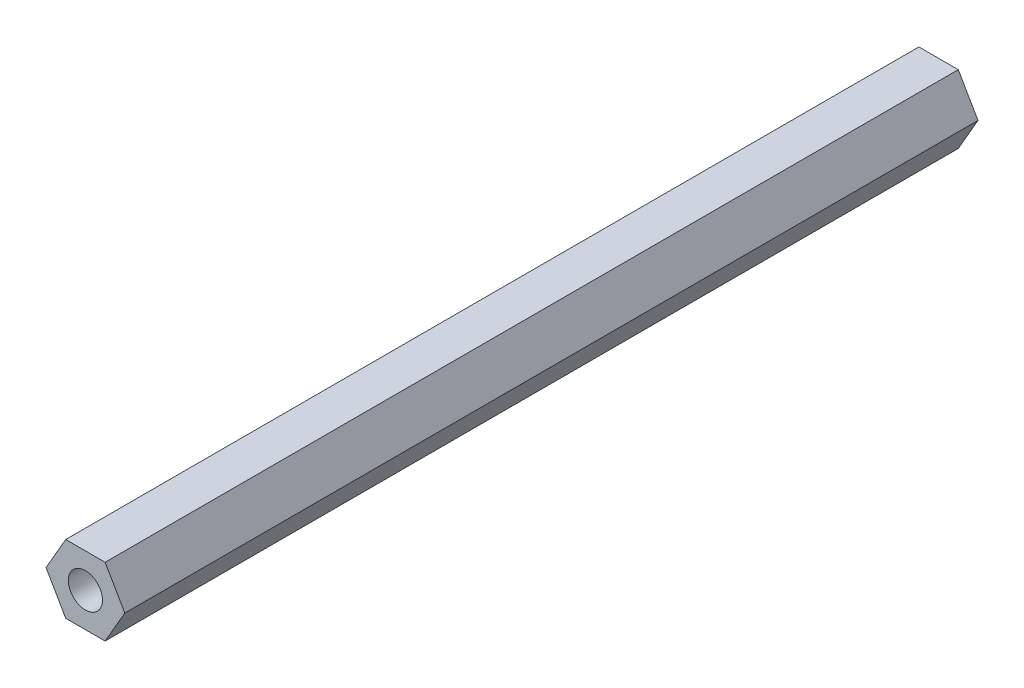
ISO-10303-21;
HEADER;
FILE_DESCRIPTION(('STEP AP214'),'2;1');
FILE_NAME('part.step','',(''),(''),'','','');
FILE_SCHEMA(('AUTOMOTIVE_DESIGN { 1 0 10303 214 1 1 1 1 }'));
ENDSEC;
DATA;
#1=APPLICATION_CONTEXT('core data for automotive mechanical design processes');
#2=APPLICATION_PROTOCOL_DEFINITION('international standard','automotive_design',2000,#1);
#3=PRODUCT_CONTEXT('',#1,'mechanical');
#4=PRODUCT('Part','Part','',(#3));
#5=PRODUCT_RELATED_PRODUCT_CATEGORY('part','',(#4));
#6=PRODUCT_DEFINITION_FORMATION('','',#4);
#7=PRODUCT_DEFINITION_CONTEXT('part definition',#1,'design');
#8=PRODUCT_DEFINITION('design','',#6,#7);
#9=PRODUCT_DEFINITION_SHAPE('','',#8);
#10=(LENGTH_UNIT() NAMED_UNIT(*) SI_UNIT(.MILLI.,.METRE.));
#11=(NAMED_UNIT(*) PLANE_ANGLE_UNIT() SI_UNIT($,.RADIAN.));
#12=(NAMED_UNIT(*) SI_UNIT($,.STERADIAN.) SOLID_ANGLE_UNIT());
#13=UNCERTAINTY_MEASURE_WITH_UNIT(LENGTH_MEASURE(1.E-05),#10,'distance_accuracy_value','');
#14=(GEOMETRIC_REPRESENTATION_CONTEXT(3) GLOBAL_UNCERTAINTY_ASSIGNED_CONTEXT((#13)) GLOBAL_UNIT_ASSIGNED_CONTEXT((#10,
#11,#12)) REPRESENTATION_CONTEXT('',''));
#15=CARTESIAN_POINT('',(0.,0.,0.));
#16=DIRECTION('',(0.,0.,1.));
#17=DIRECTION('',(1.,0.,0.));
#18=AXIS2_PLACEMENT_3D('',#15,#16,#17);
#19=CARTESIAN_POINT('',(3.66617420935419,-6.34999999999995,158.75));
#20=DIRECTION('',(-0.866025403784441,0.499999999999995,0.));
#21=DIRECTION('',(-0.499999999999995,-0.866025403784442,0.));
#22=AXIS2_PLACEMENT_3D('',#19,#20,#21);
#23=PLANE('',#22);
#24=DIRECTION('',(0.499999999999995,0.866025403784441,0.));
#25=VECTOR('',#24,1.);
#26=CARTESIAN_POINT('',(3.66617420935419,-6.34999999999995,0.));
#27=LINE('',#26,#25);
#28=CARTESIAN_POINT('',(3.66617420935419,-6.34999999999995,0.));
#29=VERTEX_POINT('',#28);
#30=CARTESIAN_POINT('',(7.33234841870824,0.,0.));
#31=VERTEX_POINT('',#30);
#32=EDGE_CURVE('E127',#29,#31,#27,.T.);
#33=ORIENTED_EDGE('',*,*,#32,.T.);
#34=DIRECTION('',(0.,0.,-1.));
#35=VECTOR('',#34,1.);
#36=CARTESIAN_POINT('',(7.33234841870824,0.,158.75));
#37=LINE('',#36,#35);
#38=CARTESIAN_POINT('',(7.33234841870824,0.,158.75));
#39=VERTEX_POINT('',#38);
#40=EDGE_CURVE('E11',#39,#31,#37,.T.);
#41=ORIENTED_EDGE('',*,*,#40,.F.);
#42=DIRECTION('',(0.499999999999995,0.866025403784441,0.));
#43=VECTOR('',#42,1.);
#44=CARTESIAN_POINT('',(3.66617420935419,-6.34999999999995,158.75));
#45=LINE('',#44,#43);
#46=CARTESIAN_POINT('',(3.66617420935419,-6.34999999999995,158.75));
#47=VERTEX_POINT('',#46);
#48=EDGE_CURVE('E138',#47,#39,#45,.T.);
#49=ORIENTED_EDGE('',*,*,#48,.F.);
#50=DIRECTION('',(0.,0.,-1.));
#51=VECTOR('',#50,1.);
#52=CARTESIAN_POINT('',(3.66617420935419,-6.34999999999995,158.75));
#53=LINE('',#52,#51);
#54=EDGE_CURVE('E123',#47,#29,#53,.T.);
#55=ORIENTED_EDGE('',*,*,#54,.T.);
#56=EDGE_LOOP('',(#33,#41,#49,#55));
#57=FACE_BOUND('',#56,.T.);
#58=ADVANCED_FACE('F43',(#57),#23,.F.);
#59=CARTESIAN_POINT('',(7.33234841870824,0.,158.75));
#60=DIRECTION('',(-0.866025403784438,-0.500000000000001,0.));
#61=DIRECTION('',(0.500000000000001,-0.866025403784438,0.));
#62=AXIS2_PLACEMENT_3D('',#59,#60,#61);
#63=PLANE('',#62);
#64=DIRECTION('',(-0.500000000000001,0.866025403784438,0.));
#65=VECTOR('',#64,1.);
#66=CARTESIAN_POINT('',(7.33234841870824,0.,0.));
#67=LINE('',#66,#65);
#68=CARTESIAN_POINT('',(3.6661742093541,6.35,0.));
#69=VERTEX_POINT('',#68);
#70=EDGE_CURVE('E130',#31,#69,#67,.T.);
#71=ORIENTED_EDGE('',*,*,#70,.T.);
#72=DIRECTION('',(0.,0.,-1.));
#73=VECTOR('',#72,1.);
#74=CARTESIAN_POINT('',(3.6661742093541,6.35,158.75));
#75=LINE('',#74,#73);
#76=CARTESIAN_POINT('',(3.6661742093541,6.35,158.75));
#77=VERTEX_POINT('',#76);
#78=EDGE_CURVE('E51',#77,#69,#75,.T.);
#79=ORIENTED_EDGE('',*,*,#78,.F.);
#80=DIRECTION('',(-0.500000000000001,0.866025403784438,0.));
#81=VECTOR('',#80,1.);
#82=CARTESIAN_POINT('',(7.33234841870824,0.,158.75));
#83=LINE('',#82,#81);
#84=EDGE_CURVE('E96',#39,#77,#83,.T.);
#85=ORIENTED_EDGE('',*,*,#84,.F.);
#86=ORIENTED_EDGE('',*,*,#40,.T.);
#87=EDGE_LOOP('',(#71,#79,#85,#86));
#88=FACE_BOUND('',#87,.T.);
#89=ADVANCED_FACE('F163',(#88),#63,.F.);
#90=CARTESIAN_POINT('',(3.6661742093541,6.35,158.75));
#91=DIRECTION('',(0.,-1.,0.));
#92=DIRECTION('',(1.,0.,0.));
#93=AXIS2_PLACEMENT_3D('',#90,#91,#92);
#94=PLANE('',#93);
#95=DIRECTION('',(-1.,0.,0.));
#96=VECTOR('',#95,1.);
#97=CARTESIAN_POINT('',(3.6661742093541,6.35,0.));
#98=LINE('',#97,#96);
#99=CARTESIAN_POINT('',(-3.66617420935415,6.34999999999997,0.));
#100=VERTEX_POINT('',#99);
#101=EDGE_CURVE('E133',#69,#100,#98,.T.);
#102=ORIENTED_EDGE('',*,*,#101,.T.);
#103=DIRECTION('',(0.,0.,-1.));
#104=VECTOR('',#103,1.);
#105=CARTESIAN_POINT('',(-3.66617420935415,6.34999999999997,158.75));
#106=LINE('',#105,#104);
#107=CARTESIAN_POINT('',(-3.66617420935415,6.34999999999997,158.75));
#108=VERTEX_POINT('',#107);
#109=EDGE_CURVE('E118',#108,#100,#106,.T.);
#110=ORIENTED_EDGE('',*,*,#109,.F.);
#111=DIRECTION('',(-1.,0.,0.));
#112=VECTOR('',#111,1.);
#113=CARTESIAN_POINT('',(3.6661742093541,6.35,158.75));
#114=LINE('',#113,#112);
#115=EDGE_CURVE('E109',#77,#108,#114,.T.);
#116=ORIENTED_EDGE('',*,*,#115,.F.);
#117=ORIENTED_EDGE('',*,*,#78,.T.);
#118=EDGE_LOOP('',(#102,#110,#116,#117));
#119=FACE_BOUND('',#118,.T.);
#120=ADVANCED_FACE('F144',(#119),#94,.F.);
#121=CARTESIAN_POINT('',(-3.66617420935415,6.34999999999997,158.75));
#122=DIRECTION('',(0.866025403784441,-0.499999999999995,0.));
#123=DIRECTION('',(0.499999999999995,0.866025403784442,0.));
#124=AXIS2_PLACEMENT_3D('',#121,#122,#123);
#125=PLANE('',#124);
#126=DIRECTION('',(-0.499999999999995,-0.866025403784442,0.));
#127=VECTOR('',#126,1.);
#128=CARTESIAN_POINT('',(-3.66617420935415,6.34999999999997,0.));
#129=LINE('',#128,#127);
#130=CARTESIAN_POINT('',(-7.33234841870824,0.,0.));
#131=VERTEX_POINT('',#130);
#132=EDGE_CURVE('E117',#100,#131,#129,.T.);
#133=ORIENTED_EDGE('',*,*,#132,.T.);
#134=DIRECTION('',(0.,0.,-1.));
#135=VECTOR('',#134,1.);
#136=CARTESIAN_POINT('',(-7.33234841870824,0.,158.75));
#137=LINE('',#136,#135);
#138=CARTESIAN_POINT('',(-7.33234841870824,0.,158.75));
#139=VERTEX_POINT('',#138);
#140=EDGE_CURVE('E114',#139,#131,#137,.T.);
#141=ORIENTED_EDGE('',*,*,#140,.F.);
#142=DIRECTION('',(-0.499999999999995,-0.866025403784442,0.));
#143=VECTOR('',#142,1.);
#144=CARTESIAN_POINT('',(-3.66617420935415,6.34999999999997,158.75));
#145=LINE('',#144,#143);
#146=EDGE_CURVE('E103',#108,#139,#145,.T.);
#147=ORIENTED_EDGE('',*,*,#146,.F.);
#148=ORIENTED_EDGE('',*,*,#109,.T.);
#149=EDGE_LOOP('',(#133,#141,#147,#148));
#150=FACE_BOUND('',#149,.T.);
#151=ADVANCED_FACE('F115',(#150),#125,.F.);
#152=CARTESIAN_POINT('',(-7.33234841870824,0.,158.75));
#153=DIRECTION('',(0.866025403784434,0.500000000000007,0.));
#154=DIRECTION('',(-0.500000000000007,0.866025403784435,0.));
#155=AXIS2_PLACEMENT_3D('',#152,#153,#154);
#156=PLANE('',#155);
#157=DIRECTION('',(0.500000000000007,-0.866025403784435,0.));
#158=VECTOR('',#157,1.);
#159=CARTESIAN_POINT('',(-7.33234841870824,0.,0.));
#160=LINE('',#159,#158);
#161=CARTESIAN_POINT('',(-3.66617420935406,-6.35000000000002,0.));
#162=VERTEX_POINT('',#161);
#163=EDGE_CURVE('E82',#131,#162,#160,.T.);
#164=ORIENTED_EDGE('',*,*,#163,.T.);
#165=DIRECTION('',(0.,0.,-1.));
#166=VECTOR('',#165,1.);
#167=CARTESIAN_POINT('',(-3.66617420935406,-6.35000000000002,158.75));
#168=LINE('',#167,#166);
#169=CARTESIAN_POINT('',(-3.66617420935406,-6.35000000000002,158.75));
#170=VERTEX_POINT('',#169);
#171=EDGE_CURVE('E119',#170,#162,#168,.T.);
#172=ORIENTED_EDGE('',*,*,#171,.F.);
#173=DIRECTION('',(0.500000000000007,-0.866025403784435,0.));
#174=VECTOR('',#173,1.);
#175=CARTESIAN_POINT('',(-7.33234841870824,0.,158.75));
#176=LINE('',#175,#174);
#177=EDGE_CURVE('E107',#139,#170,#176,.T.);
#178=ORIENTED_EDGE('',*,*,#177,.F.);
#179=ORIENTED_EDGE('',*,*,#140,.T.);
#180=EDGE_LOOP('',(#164,#172,#178,#179));
#181=FACE_BOUND('',#180,.T.);
#182=ADVANCED_FACE('F121',(#181),#156,.F.);
#183=CARTESIAN_POINT('',(-3.66617420935406,-6.35000000000002,158.75));
#184=DIRECTION('',(0.,1.,0.));
#185=DIRECTION('',(-1.,0.,0.));
#186=AXIS2_PLACEMENT_3D('',#183,#184,#185);
#187=PLANE('',#186);
#188=DIRECTION('',(1.,0.,0.));
#189=VECTOR('',#188,1.);
#190=CARTESIAN_POINT('',(-3.66617420935406,-6.35000000000002,0.));
#191=LINE('',#190,#189);
#192=EDGE_CURVE('E88',#162,#29,#191,.T.);
#193=ORIENTED_EDGE('',*,*,#192,.T.);
#194=ORIENTED_EDGE('',*,*,#54,.F.);
#195=DIRECTION('',(1.,0.,0.));
#196=VECTOR('',#195,1.);
#197=CARTESIAN_POINT('',(-3.66617420935406,-6.35000000000002,158.75));
#198=LINE('',#197,#196);
#199=EDGE_CURVE('E59',#170,#47,#198,.T.);
#200=ORIENTED_EDGE('',*,*,#199,.F.);
#201=ORIENTED_EDGE('',*,*,#171,.T.);
#202=EDGE_LOOP('',(#193,#194,#200,#201));
#203=FACE_BOUND('',#202,.T.);
#204=ADVANCED_FACE('F151',(#203),#187,.F.);
#205=CARTESIAN_POINT('',(0.,0.,158.75));
#206=DIRECTION('',(0.,0.,1.));
#207=DIRECTION('',(1.,0.,0.));
#208=AXIS2_PLACEMENT_3D('',#205,#206,#207);
#209=PLANE('',#208);
#210=CARTESIAN_POINT('',(0.,0.,158.75));
#211=DIRECTION('',(0.,0.,1.));
#212=DIRECTION('',(1.,0.,0.));
#213=AXIS2_PLACEMENT_3D('',#210,#211,#212);
#214=CIRCLE('',#213,3.175);
#215=CARTESIAN_POINT('',(3.175,0.,158.75));
#216=VERTEX_POINT('',#215);
#217=EDGE_CURVE('E219',#216,#216,#214,.T.);
#218=ORIENTED_EDGE('',*,*,#217,.F.);
#219=EDGE_LOOP('',(#218));
#220=FACE_BOUND('',#219,.T.);
#221=ORIENTED_EDGE('',*,*,#48,.T.);
#222=ORIENTED_EDGE('',*,*,#84,.T.);
#223=ORIENTED_EDGE('',*,*,#115,.T.);
#224=ORIENTED_EDGE('',*,*,#146,.T.);
#225=ORIENTED_EDGE('',*,*,#177,.T.);
#226=ORIENTED_EDGE('',*,*,#199,.T.);
#227=EDGE_LOOP('',(#221,#222,#223,#224,#225,#226));
#228=FACE_BOUND('',#227,.T.);
#229=ADVANCED_FACE('F105',(#220,#228),#209,.T.);
#230=CARTESIAN_POINT('',(0.,0.,0.));
#231=DIRECTION('',(0.,0.,1.));
#232=DIRECTION('',(1.,0.,0.));
#233=AXIS2_PLACEMENT_3D('',#230,#231,#232);
#234=PLANE('',#233);
#235=CARTESIAN_POINT('',(0.,0.,0.));
#236=DIRECTION('',(0.,0.,1.));
#237=DIRECTION('',(1.,0.,0.));
#238=AXIS2_PLACEMENT_3D('',#235,#236,#237);
#239=CIRCLE('',#238,3.175);
#240=CARTESIAN_POINT('',(3.175,0.,0.));
#241=VERTEX_POINT('',#240);
#242=EDGE_CURVE('E131',#241,#241,#239,.T.);
#243=ORIENTED_EDGE('',*,*,#242,.T.);
#244=EDGE_LOOP('',(#243));
#245=FACE_BOUND('',#244,.T.);
#246=ORIENTED_EDGE('',*,*,#32,.F.);
#247=ORIENTED_EDGE('',*,*,#192,.F.);
#248=ORIENTED_EDGE('',*,*,#163,.F.);
#249=ORIENTED_EDGE('',*,*,#132,.F.);
#250=ORIENTED_EDGE('',*,*,#101,.F.);
#251=ORIENTED_EDGE('',*,*,#70,.F.);
#252=EDGE_LOOP('',(#246,#247,#248,#249,#250,#251));
#253=FACE_BOUND('',#252,.T.);
#254=ADVANCED_FACE('F147',(#245,#253),#234,.F.);
#255=CARTESIAN_POINT('',(0.,0.,0.));
#256=DIRECTION('',(0.,0.,1.));
#257=DIRECTION('',(1.,0.,0.));
#258=AXIS2_PLACEMENT_3D('',#255,#256,#257);
#259=CYLINDRICAL_SURFACE('',#258,3.175);
#260=CARTESIAN_POINT('',(3.175,0.,0.));
#261=CARTESIAN_POINT('',(3.175,0.,1.65364583333333));
#262=CARTESIAN_POINT('',(3.175,0.,3.30729166666667));
#263=CARTESIAN_POINT('',(3.175,0.,6.61458333333333));
#264=CARTESIAN_POINT('',(3.175,0.,8.26822916666666));
#265=CARTESIAN_POINT('',(3.175,0.,11.5755208333333));
#266=CARTESIAN_POINT('',(3.175,0.,13.2291666666667));
#267=CARTESIAN_POINT('',(3.175,0.,16.5364583333333));
#268=CARTESIAN_POINT('',(3.175,0.,18.1901041666667));
#269=CARTESIAN_POINT('',(3.175,0.,21.4973958333333));
#270=CARTESIAN_POINT('',(3.175,0.,23.1510416666667));
#271=CARTESIAN_POINT('',(3.175,0.,26.4583333333333));
#272=CARTESIAN_POINT('',(3.175,0.,28.1119791666667));
#273=CARTESIAN_POINT('',(3.175,0.,31.4192708333333));
#274=CARTESIAN_POINT('',(3.175,0.,33.0729166666667));
#275=CARTESIAN_POINT('',(3.175,0.,36.3802083333333));
#276=CARTESIAN_POINT('',(3.175,0.,38.0338541666667));
#277=CARTESIAN_POINT('',(3.175,0.,41.3411458333333));
#278=CARTESIAN_POINT('',(3.175,0.,42.9947916666667));
#279=CARTESIAN_POINT('',(3.175,0.,46.3020833333333));
#280=CARTESIAN_POINT('',(3.175,0.,47.9557291666667));
#281=CARTESIAN_POINT('',(3.175,0.,51.2630208333333));
#282=CARTESIAN_POINT('',(3.175,0.,52.9166666666667));
#283=CARTESIAN_POINT('',(3.175,0.,56.2239583333333));
#284=CARTESIAN_POINT('',(3.175,0.,57.8776041666667));
#285=CARTESIAN_POINT('',(3.175,0.,61.1848958333333));
#286=CARTESIAN_POINT('',(3.175,0.,62.8385416666667));
#287=CARTESIAN_POINT('',(3.175,0.,66.1458333333333));
#288=CARTESIAN_POINT('',(3.175,0.,67.7994791666667));
#289=CARTESIAN_POINT('',(3.175,0.,71.1067708333333));
#290=CARTESIAN_POINT('',(3.175,0.,72.7604166666667));
#291=CARTESIAN_POINT('',(3.175,0.,76.0677083333333));
#292=CARTESIAN_POINT('',(3.175,0.,77.7213541666667));
#293=CARTESIAN_POINT('',(3.175,0.,81.0286458333333));
#294=CARTESIAN_POINT('',(3.175,0.,82.6822916666667));
#295=CARTESIAN_POINT('',(3.175,0.,85.9895833333333));
#296=CARTESIAN_POINT('',(3.175,0.,87.6432291666667));
#297=CARTESIAN_POINT('',(3.175,0.,90.9505208333333));
#298=CARTESIAN_POINT('',(3.175,0.,92.6041666666667));
#299=CARTESIAN_POINT('',(3.175,0.,95.9114583333333));
#300=CARTESIAN_POINT('',(3.175,0.,97.5651041666667));
#301=CARTESIAN_POINT('',(3.175,0.,100.872395833333));
#302=CARTESIAN_POINT('',(3.175,0.,102.526041666667));
#303=CARTESIAN_POINT('',(3.175,0.,105.833333333333));
#304=CARTESIAN_POINT('',(3.175,0.,107.486979166667));
#305=CARTESIAN_POINT('',(3.175,0.,110.794270833333));
#306=CARTESIAN_POINT('',(3.175,0.,112.447916666667));
#307=CARTESIAN_POINT('',(3.175,0.,115.755208333333));
#308=CARTESIAN_POINT('',(3.175,0.,117.408854166667));
#309=CARTESIAN_POINT('',(3.175,0.,120.716145833333));
#310=CARTESIAN_POINT('',(3.175,0.,122.369791666667));
#311=CARTESIAN_POINT('',(3.175,0.,125.677083333333));
#312=CARTESIAN_POINT('',(3.175,0.,127.330729166667));
#313=CARTESIAN_POINT('',(3.175,0.,130.638020833333));
#314=CARTESIAN_POINT('',(3.175,0.,132.291666666667));
#315=CARTESIAN_POINT('',(3.175,0.,135.598958333333));
#316=CARTESIAN_POINT('',(3.175,0.,137.252604166667));
#317=CARTESIAN_POINT('',(3.175,0.,140.559895833333));
#318=CARTESIAN_POINT('',(3.175,0.,142.213541666667));
#319=CARTESIAN_POINT('',(3.175,0.,145.520833333333));
#320=CARTESIAN_POINT('',(3.175,0.,147.174479166667));
#321=CARTESIAN_POINT('',(3.175,0.,150.481770833333));
#322=CARTESIAN_POINT('',(3.175,0.,152.135416666667));
#323=CARTESIAN_POINT('',(3.175,0.,155.442708333333));
#324=CARTESIAN_POINT('',(3.175,0.,157.096354166667));
#325=CARTESIAN_POINT('',(3.175,0.,158.75));
#326=B_SPLINE_CURVE_WITH_KNOTS('',3,(#260,#261,#262,#263,#264,#265,#266,#267,#268,#269,#270,
#271,#272,#273,#274,#275,#276,#277,#278,#279,#280,#281,#282,#283,#284,#285,#286,#287,#288,#289,
#290,#291,#292,#293,#294,#295,#296,#297,#298,#299,#300,#301,#302,#303,#304,#305,#306,#307,#308,
#309,#310,#311,#312,#313,#314,#315,#316,#317,#318,#319,#320,#321,#322,#323,#324,#325),
.UNSPECIFIED.,.F.,.F.,(4,2,2,2,2,2,2,2,2,2,2,2,2,2,2,2,2,2,2,2,2,2,2,2,2,2,2,2,2,2,2,2,4),(0.,
4.9609375,9.921875,14.8828125,19.84375,24.8046875,29.765625,34.7265625,39.6875,44.6484375,
49.609375,54.5703125,59.53125,64.4921875,69.453125,74.4140625,79.375,84.3359375,89.296875,
94.2578125,99.21875,104.1796875,109.140625,114.1015625,119.0625,124.0234375,128.984375,
133.9453125,138.90625,143.8671875,148.828125,153.7890625,158.75),.UNSPECIFIED.);
#327=EDGE_CURVE('BSEAM202',#241,#216,#326,.T.);
#328=ORIENTED_EDGE('',*,*,#242,.F.);
#329=ORIENTED_EDGE('',*,*,#217,.T.);
#330=ORIENTED_EDGE('',*,*,#327,.T.);
#331=ORIENTED_EDGE('',*,*,#327,.F.);
#332=EDGE_LOOP('',(#328,#330,#329,#331));
#333=FACE_BOUND('',#332,.T.);
#334=ADVANCED_FACE('F202',(#333),#259,.F.);
#335=CLOSED_SHELL('',(#58,#89,#120,#151,#182,#204,#229,#254,#334));
#336=MANIFOLD_SOLID_BREP('B2',#335);
#337=ADVANCED_BREP_SHAPE_REPRESENTATION('',(#18,#336),#14);
#338=SHAPE_DEFINITION_REPRESENTATION(#9,#337);
ENDSEC;
END-ISO-10303-21;
